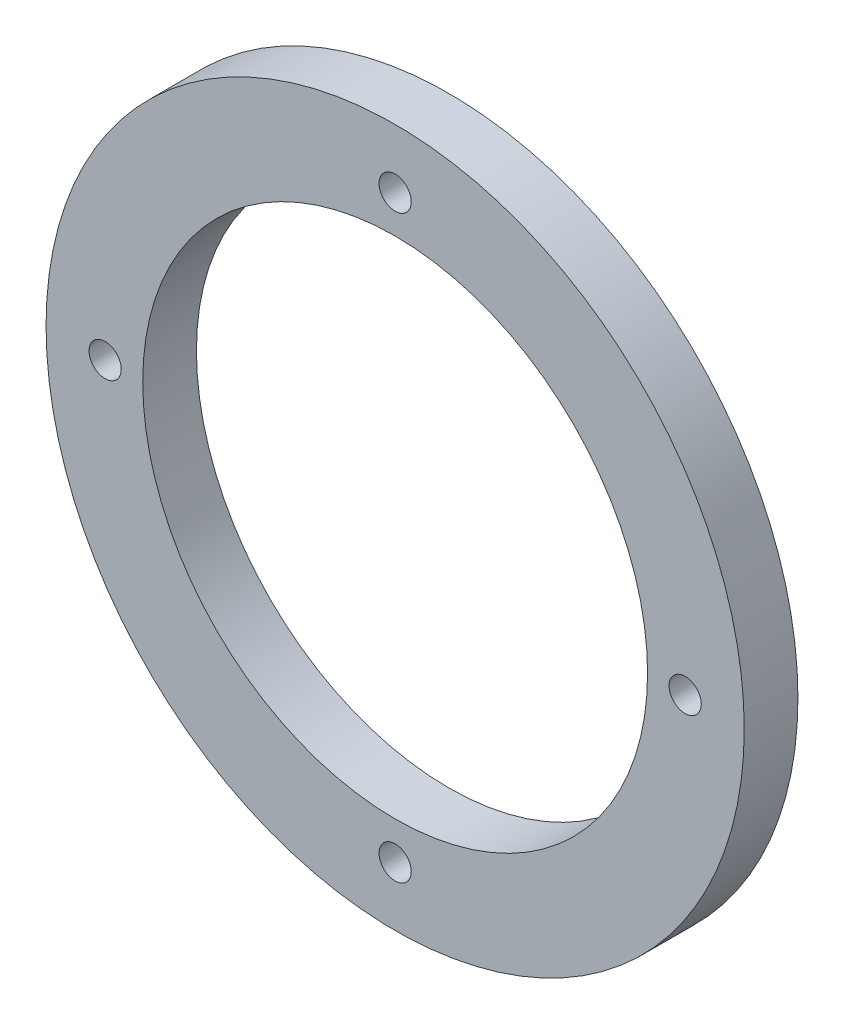
ISO-10303-21;
HEADER;
FILE_DESCRIPTION(('STEP AP214'),'2;1');
FILE_NAME('part.step','',(''),(''),'','','');
FILE_SCHEMA(('AUTOMOTIVE_DESIGN { 1 0 10303 214 1 1 1 1 }'));
ENDSEC;
DATA;
#1=APPLICATION_CONTEXT('core data for automotive mechanical design processes');
#2=APPLICATION_PROTOCOL_DEFINITION('international standard','automotive_design',2000,#1);
#3=PRODUCT_CONTEXT('',#1,'mechanical');
#4=PRODUCT('Part','Part','',(#3));
#5=PRODUCT_RELATED_PRODUCT_CATEGORY('part','',(#4));
#6=PRODUCT_DEFINITION_FORMATION('','',#4);
#7=PRODUCT_DEFINITION_CONTEXT('part definition',#1,'design');
#8=PRODUCT_DEFINITION('design','',#6,#7);
#9=PRODUCT_DEFINITION_SHAPE('','',#8);
#10=(LENGTH_UNIT() NAMED_UNIT(*) SI_UNIT(.MILLI.,.METRE.));
#11=(NAMED_UNIT(*) PLANE_ANGLE_UNIT() SI_UNIT($,.RADIAN.));
#12=(NAMED_UNIT(*) SI_UNIT($,.STERADIAN.) SOLID_ANGLE_UNIT());
#13=UNCERTAINTY_MEASURE_WITH_UNIT(LENGTH_MEASURE(1.E-05),#10,'distance_accuracy_value','');
#14=(GEOMETRIC_REPRESENTATION_CONTEXT(3) GLOBAL_UNCERTAINTY_ASSIGNED_CONTEXT((#13)) GLOBAL_UNIT_ASSIGNED_CONTEXT((#10,
#11,#12)) REPRESENTATION_CONTEXT('',''));
#15=CARTESIAN_POINT('',(0.,0.,0.));
#16=DIRECTION('',(0.,0.,1.));
#17=DIRECTION('',(1.,0.,0.));
#18=AXIS2_PLACEMENT_3D('',#15,#16,#17);
#19=CARTESIAN_POINT('',(0.,0.,5.));
#20=DIRECTION('',(0.,0.,1.));
#21=DIRECTION('',(1.,0.,0.));
#22=AXIS2_PLACEMENT_3D('',#19,#20,#21);
#23=PLANE('',#22);
#24=CARTESIAN_POINT('',(0.,27.,5.));
#25=DIRECTION('',(0.,0.,1.));
#26=DIRECTION('',(1.,0.,0.));
#27=AXIS2_PLACEMENT_3D('',#24,#25,#26);
#28=CIRCLE('',#27,1.5);
#29=CARTESIAN_POINT('',(1.5,27.,5.));
#30=VERTEX_POINT('',#29);
#31=EDGE_CURVE('E59',#30,#30,#28,.T.);
#32=ORIENTED_EDGE('',*,*,#31,.F.);
#33=EDGE_LOOP('',(#32));
#34=FACE_BOUND('',#33,.T.);
#35=CARTESIAN_POINT('',(-27.,0.,5.));
#36=DIRECTION('',(0.,0.,1.));
#37=DIRECTION('',(1.,0.,0.));
#38=AXIS2_PLACEMENT_3D('',#35,#36,#37);
#39=CIRCLE('',#38,1.5);
#40=CARTESIAN_POINT('',(-25.5,0.,5.));
#41=VERTEX_POINT('',#40);
#42=EDGE_CURVE('E47',#41,#41,#39,.T.);
#43=ORIENTED_EDGE('',*,*,#42,.F.);
#44=EDGE_LOOP('',(#43));
#45=FACE_BOUND('',#44,.T.);
#46=CARTESIAN_POINT('',(0.,0.,5.));
#47=DIRECTION('',(0.,0.,1.));
#48=DIRECTION('',(1.,0.,0.));
#49=AXIS2_PLACEMENT_3D('',#46,#47,#48);
#50=CIRCLE('',#49,32.5);
#51=CARTESIAN_POINT('',(32.5,0.,5.));
#52=VERTEX_POINT('',#51);
#53=EDGE_CURVE('E10',#52,#52,#50,.T.);
#54=ORIENTED_EDGE('',*,*,#53,.T.);
#55=EDGE_LOOP('',(#54));
#56=FACE_BOUND('',#55,.T.);
#57=CARTESIAN_POINT('',(0.,0.,5.));
#58=DIRECTION('',(0.,0.,1.));
#59=DIRECTION('',(1.,0.,0.));
#60=AXIS2_PLACEMENT_3D('',#57,#58,#59);
#61=CIRCLE('',#60,23.5);
#62=CARTESIAN_POINT('',(23.5,0.,5.));
#63=VERTEX_POINT('',#62);
#64=EDGE_CURVE('E42',#63,#63,#61,.T.);
#65=ORIENTED_EDGE('',*,*,#64,.F.);
#66=EDGE_LOOP('',(#65));
#67=FACE_BOUND('',#66,.T.);
#68=CARTESIAN_POINT('',(27.,0.,5.));
#69=DIRECTION('',(0.,0.,1.));
#70=DIRECTION('',(1.,0.,0.));
#71=AXIS2_PLACEMENT_3D('',#68,#69,#70);
#72=CIRCLE('',#71,1.5);
#73=CARTESIAN_POINT('',(28.5,0.,5.));
#74=VERTEX_POINT('',#73);
#75=EDGE_CURVE('E53',#74,#74,#72,.T.);
#76=ORIENTED_EDGE('',*,*,#75,.F.);
#77=EDGE_LOOP('',(#76));
#78=FACE_BOUND('',#77,.T.);
#79=CARTESIAN_POINT('',(0.,-27.,5.));
#80=DIRECTION('',(0.,0.,1.));
#81=DIRECTION('',(1.,0.,0.));
#82=AXIS2_PLACEMENT_3D('',#79,#80,#81);
#83=CIRCLE('',#82,1.5);
#84=CARTESIAN_POINT('',(1.5,-27.,5.));
#85=VERTEX_POINT('',#84);
#86=EDGE_CURVE('E65',#85,#85,#83,.T.);
#87=ORIENTED_EDGE('',*,*,#86,.F.);
#88=EDGE_LOOP('',(#87));
#89=FACE_BOUND('',#88,.T.);
#90=ADVANCED_FACE('F31',(#34,#45,#56,#67,#78,#89),#23,.T.);
#91=CARTESIAN_POINT('',(0.,0.,0.));
#92=DIRECTION('',(0.,0.,1.));
#93=DIRECTION('',(1.,0.,0.));
#94=AXIS2_PLACEMENT_3D('',#91,#92,#93);
#95=PLANE('',#94);
#96=CARTESIAN_POINT('',(0.,0.,0.));
#97=DIRECTION('',(0.,0.,1.));
#98=DIRECTION('',(1.,0.,0.));
#99=AXIS2_PLACEMENT_3D('',#96,#97,#98);
#100=CIRCLE('',#99,32.5);
#101=CARTESIAN_POINT('',(32.5,0.,0.));
#102=VERTEX_POINT('',#101);
#103=EDGE_CURVE('E35',#102,#102,#100,.T.);
#104=ORIENTED_EDGE('',*,*,#103,.F.);
#105=EDGE_LOOP('',(#104));
#106=FACE_BOUND('',#105,.T.);
#107=CARTESIAN_POINT('',(0.,0.,0.));
#108=DIRECTION('',(0.,0.,1.));
#109=DIRECTION('',(1.,0.,0.));
#110=AXIS2_PLACEMENT_3D('',#107,#108,#109);
#111=CIRCLE('',#110,23.5);
#112=CARTESIAN_POINT('',(23.5,0.,0.));
#113=VERTEX_POINT('',#112);
#114=EDGE_CURVE('E44',#113,#113,#111,.T.);
#115=ORIENTED_EDGE('',*,*,#114,.T.);
#116=EDGE_LOOP('',(#115));
#117=FACE_BOUND('',#116,.T.);
#118=CARTESIAN_POINT('',(-27.,0.,0.));
#119=DIRECTION('',(0.,0.,1.));
#120=DIRECTION('',(1.,0.,0.));
#121=AXIS2_PLACEMENT_3D('',#118,#119,#120);
#122=CIRCLE('',#121,1.5);
#123=CARTESIAN_POINT('',(-25.5,0.,0.));
#124=VERTEX_POINT('',#123);
#125=EDGE_CURVE('E50',#124,#124,#122,.T.);
#126=ORIENTED_EDGE('',*,*,#125,.T.);
#127=EDGE_LOOP('',(#126));
#128=FACE_BOUND('',#127,.T.);
#129=CARTESIAN_POINT('',(27.,0.,0.));
#130=DIRECTION('',(0.,0.,1.));
#131=DIRECTION('',(1.,0.,0.));
#132=AXIS2_PLACEMENT_3D('',#129,#130,#131);
#133=CIRCLE('',#132,1.5);
#134=CARTESIAN_POINT('',(28.5,0.,0.));
#135=VERTEX_POINT('',#134);
#136=EDGE_CURVE('E56',#135,#135,#133,.T.);
#137=ORIENTED_EDGE('',*,*,#136,.T.);
#138=EDGE_LOOP('',(#137));
#139=FACE_BOUND('',#138,.T.);
#140=CARTESIAN_POINT('',(0.,27.,0.));
#141=DIRECTION('',(0.,0.,1.));
#142=DIRECTION('',(1.,0.,0.));
#143=AXIS2_PLACEMENT_3D('',#140,#141,#142);
#144=CIRCLE('',#143,1.5);
#145=CARTESIAN_POINT('',(1.5,27.,0.));
#146=VERTEX_POINT('',#145);
#147=EDGE_CURVE('E62',#146,#146,#144,.T.);
#148=ORIENTED_EDGE('',*,*,#147,.T.);
#149=EDGE_LOOP('',(#148));
#150=FACE_BOUND('',#149,.T.);
#151=CARTESIAN_POINT('',(0.,-27.,0.));
#152=DIRECTION('',(0.,0.,1.));
#153=DIRECTION('',(1.,0.,0.));
#154=AXIS2_PLACEMENT_3D('',#151,#152,#153);
#155=CIRCLE('',#154,1.5);
#156=CARTESIAN_POINT('',(1.5,-27.,0.));
#157=VERTEX_POINT('',#156);
#158=EDGE_CURVE('E68',#157,#157,#155,.T.);
#159=ORIENTED_EDGE('',*,*,#158,.T.);
#160=EDGE_LOOP('',(#159));
#161=FACE_BOUND('',#160,.T.);
#162=ADVANCED_FACE('F78',(#106,#117,#128,#139,#150,#161),#95,.F.);
#163=CARTESIAN_POINT('',(0.,0.,5.));
#164=DIRECTION('',(0.,0.,-1.));
#165=DIRECTION('',(-1.,0.,0.));
#166=AXIS2_PLACEMENT_3D('',#163,#164,#165);
#167=CYLINDRICAL_SURFACE('',#166,32.5);
#168=ORIENTED_EDGE('',*,*,#53,.F.);
#169=EDGE_LOOP('',(#168));
#170=FACE_BOUND('',#169,.T.);
#171=ORIENTED_EDGE('',*,*,#103,.T.);
#172=EDGE_LOOP('',(#171));
#173=FACE_BOUND('',#172,.T.);
#174=ADVANCED_FACE('F33',(#170,#173),#167,.T.);
#175=CARTESIAN_POINT('',(0.,0.,5.));
#176=DIRECTION('',(0.,0.,-1.));
#177=DIRECTION('',(-1.,0.,0.));
#178=AXIS2_PLACEMENT_3D('',#175,#176,#177);
#179=CYLINDRICAL_SURFACE('',#178,23.5);
#180=ORIENTED_EDGE('',*,*,#64,.T.);
#181=EDGE_LOOP('',(#180));
#182=FACE_BOUND('',#181,.T.);
#183=ORIENTED_EDGE('',*,*,#114,.F.);
#184=EDGE_LOOP('',(#183));
#185=FACE_BOUND('',#184,.T.);
#186=ADVANCED_FACE('F88',(#182,#185),#179,.F.);
#187=CARTESIAN_POINT('',(-27.,0.,5.));
#188=DIRECTION('',(0.,0.,-1.));
#189=DIRECTION('',(-1.,0.,0.));
#190=AXIS2_PLACEMENT_3D('',#187,#188,#189);
#191=CYLINDRICAL_SURFACE('',#190,1.5);
#192=ORIENTED_EDGE('',*,*,#42,.T.);
#193=EDGE_LOOP('',(#192));
#194=FACE_BOUND('',#193,.T.);
#195=ORIENTED_EDGE('',*,*,#125,.F.);
#196=EDGE_LOOP('',(#195));
#197=FACE_BOUND('',#196,.T.);
#198=ADVANCED_FACE('F91',(#194,#197),#191,.F.);
#199=CARTESIAN_POINT('',(27.,0.,5.));
#200=DIRECTION('',(0.,0.,-1.));
#201=DIRECTION('',(-1.,0.,0.));
#202=AXIS2_PLACEMENT_3D('',#199,#200,#201);
#203=CYLINDRICAL_SURFACE('',#202,1.5);
#204=ORIENTED_EDGE('',*,*,#75,.T.);
#205=EDGE_LOOP('',(#204));
#206=FACE_BOUND('',#205,.T.);
#207=ORIENTED_EDGE('',*,*,#136,.F.);
#208=EDGE_LOOP('',(#207));
#209=FACE_BOUND('',#208,.T.);
#210=ADVANCED_FACE('F95',(#206,#209),#203,.F.);
#211=CARTESIAN_POINT('',(0.,27.,5.));
#212=DIRECTION('',(0.,0.,-1.));
#213=DIRECTION('',(-1.,0.,0.));
#214=AXIS2_PLACEMENT_3D('',#211,#212,#213);
#215=CYLINDRICAL_SURFACE('',#214,1.5);
#216=ORIENTED_EDGE('',*,*,#31,.T.);
#217=EDGE_LOOP('',(#216));
#218=FACE_BOUND('',#217,.T.);
#219=ORIENTED_EDGE('',*,*,#147,.F.);
#220=EDGE_LOOP('',(#219));
#221=FACE_BOUND('',#220,.T.);
#222=ADVANCED_FACE('F99',(#218,#221),#215,.F.);
#223=CARTESIAN_POINT('',(0.,-27.,5.));
#224=DIRECTION('',(0.,0.,-1.));
#225=DIRECTION('',(-1.,0.,0.));
#226=AXIS2_PLACEMENT_3D('',#223,#224,#225);
#227=CYLINDRICAL_SURFACE('',#226,1.5);
#228=ORIENTED_EDGE('',*,*,#86,.T.);
#229=EDGE_LOOP('',(#228));
#230=FACE_BOUND('',#229,.T.);
#231=ORIENTED_EDGE('',*,*,#158,.F.);
#232=EDGE_LOOP('',(#231));
#233=FACE_BOUND('',#232,.T.);
#234=ADVANCED_FACE('F74',(#230,#233),#227,.F.);
#235=CLOSED_SHELL('',(#90,#162,#174,#186,#198,#210,#222,#234));
#236=MANIFOLD_SOLID_BREP('B2',#235);
#237=ADVANCED_BREP_SHAPE_REPRESENTATION('',(#18,#236),#14);
#238=SHAPE_DEFINITION_REPRESENTATION(#9,#237);
ENDSEC;
END-ISO-10303-21;
